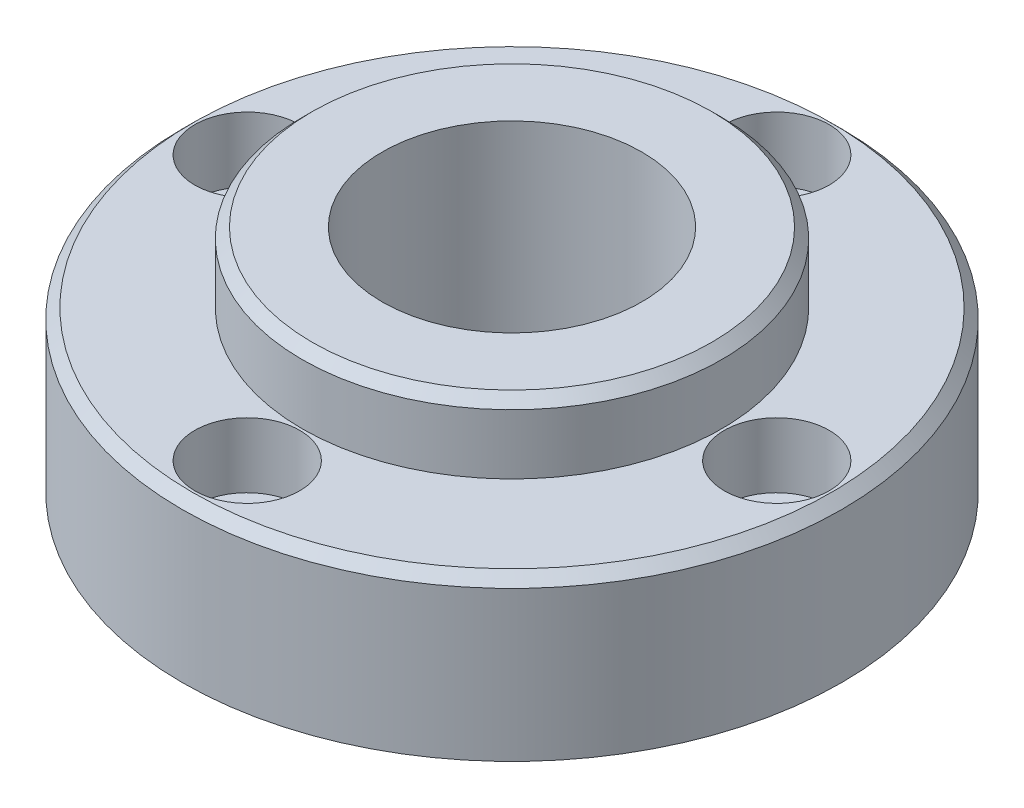
ISO-10303-21;
HEADER;
FILE_DESCRIPTION(('STEP AP214'),'2;1');
FILE_NAME('part.step','',(''),(''),'','','');
FILE_SCHEMA(('AUTOMOTIVE_DESIGN { 1 0 10303 214 1 1 1 1 }'));
ENDSEC;
DATA;
#1=APPLICATION_CONTEXT('core data for automotive mechanical design processes');
#2=APPLICATION_PROTOCOL_DEFINITION('international standard','automotive_design',2000,#1);
#3=PRODUCT_CONTEXT('',#1,'mechanical');
#4=PRODUCT('Part','Part','',(#3));
#5=PRODUCT_RELATED_PRODUCT_CATEGORY('part','',(#4));
#6=PRODUCT_DEFINITION_FORMATION('','',#4);
#7=PRODUCT_DEFINITION_CONTEXT('part definition',#1,'design');
#8=PRODUCT_DEFINITION('design','',#6,#7);
#9=PRODUCT_DEFINITION_SHAPE('','',#8);
#10=(LENGTH_UNIT() NAMED_UNIT(*) SI_UNIT(.MILLI.,.METRE.));
#11=(NAMED_UNIT(*) PLANE_ANGLE_UNIT() SI_UNIT($,.RADIAN.));
#12=(NAMED_UNIT(*) SI_UNIT($,.STERADIAN.) SOLID_ANGLE_UNIT());
#13=UNCERTAINTY_MEASURE_WITH_UNIT(LENGTH_MEASURE(1.E-05),#10,'distance_accuracy_value','');
#14=(GEOMETRIC_REPRESENTATION_CONTEXT(3) GLOBAL_UNCERTAINTY_ASSIGNED_CONTEXT((#13)) GLOBAL_UNIT_ASSIGNED_CONTEXT((#10,
#11,#12)) REPRESENTATION_CONTEXT('',''));
#15=CARTESIAN_POINT('',(0.,0.,0.));
#16=DIRECTION('',(0.,0.,1.));
#17=DIRECTION('',(1.,0.,0.));
#18=AXIS2_PLACEMENT_3D('',#15,#16,#17);
#19=CARTESIAN_POINT('',(0.,0.,0.));
#20=DIRECTION('',(0.,1.,0.));
#21=DIRECTION('',(0.,0.,1.));
#22=AXIS2_PLACEMENT_3D('',#19,#20,#21);
#23=PLANE('',#22);
#24=CARTESIAN_POINT('',(2.77572927208196E-13,0.,-26.5));
#25=DIRECTION('',(0.,1.,0.));
#26=DIRECTION('',(0.,0.,1.));
#27=AXIS2_PLACEMENT_3D('',#24,#25,#26);
#28=CIRCLE('',#27,3.25);
#29=CARTESIAN_POINT('',(2.77572927208196E-13,0.,-23.25));
#30=VERTEX_POINT('',#29);
#31=EDGE_CURVE('E115',#30,#30,#28,.T.);
#32=ORIENTED_EDGE('',*,*,#31,.T.);
#33=EDGE_LOOP('',(#32));
#34=FACE_BOUND('',#33,.T.);
#35=CARTESIAN_POINT('',(-26.5,0.,0.));
#36=DIRECTION('',(0.,1.,0.));
#37=DIRECTION('',(0.,0.,1.));
#38=AXIS2_PLACEMENT_3D('',#35,#36,#37);
#39=CIRCLE('',#38,3.25);
#40=CARTESIAN_POINT('',(-26.5,0.,3.25));
#41=VERTEX_POINT('',#40);
#42=EDGE_CURVE('E109',#41,#41,#39,.T.);
#43=ORIENTED_EDGE('',*,*,#42,.T.);
#44=EDGE_LOOP('',(#43));
#45=FACE_BOUND('',#44,.T.);
#46=CARTESIAN_POINT('',(0.,0.,26.5));
#47=DIRECTION('',(0.,1.,0.));
#48=DIRECTION('',(0.,0.,1.));
#49=AXIS2_PLACEMENT_3D('',#46,#47,#48);
#50=CIRCLE('',#49,3.25);
#51=CARTESIAN_POINT('',(0.,0.,29.75));
#52=VERTEX_POINT('',#51);
#53=EDGE_CURVE('E101',#52,#52,#50,.T.);
#54=ORIENTED_EDGE('',*,*,#53,.T.);
#55=EDGE_LOOP('',(#54));
#56=FACE_BOUND('',#55,.T.);
#57=CARTESIAN_POINT('',(26.5,0.,0.));
#58=DIRECTION('',(0.,1.,0.));
#59=DIRECTION('',(0.,0.,1.));
#60=AXIS2_PLACEMENT_3D('',#57,#58,#59);
#61=CIRCLE('',#60,3.25);
#62=CARTESIAN_POINT('',(26.5,0.,3.25));
#63=VERTEX_POINT('',#62);
#64=EDGE_CURVE('E77',#63,#63,#61,.T.);
#65=ORIENTED_EDGE('',*,*,#64,.T.);
#66=EDGE_LOOP('',(#65));
#67=FACE_BOUND('',#66,.T.);
#68=CARTESIAN_POINT('',(0.,0.,0.));
#69=DIRECTION('',(0.,1.,0.));
#70=DIRECTION('',(0.,0.,1.));
#71=AXIS2_PLACEMENT_3D('',#68,#69,#70);
#72=CIRCLE('',#71,33.);
#73=CARTESIAN_POINT('',(0.,0.,33.));
#74=VERTEX_POINT('',#73);
#75=EDGE_CURVE('E58',#74,#74,#72,.T.);
#76=ORIENTED_EDGE('',*,*,#75,.F.);
#77=EDGE_LOOP('',(#76));
#78=FACE_BOUND('',#77,.T.);
#79=CARTESIAN_POINT('',(0.,0.,0.));
#80=DIRECTION('',(0.,1.,0.));
#81=DIRECTION('',(0.,0.,1.));
#82=AXIS2_PLACEMENT_3D('',#79,#80,#81);
#83=CIRCLE('',#82,17.);
#84=CARTESIAN_POINT('',(0.,0.,17.));
#85=VERTEX_POINT('',#84);
#86=EDGE_CURVE('E55',#85,#85,#83,.F.);
#87=ORIENTED_EDGE('',*,*,#86,.F.);
#88=EDGE_LOOP('',(#87));
#89=FACE_BOUND('',#88,.T.);
#90=ADVANCED_FACE('F35',(#34,#45,#56,#67,#78,#89),#23,.F.);
#91=CARTESIAN_POINT('',(0.,16.,0.));
#92=DIRECTION('',(0.,1.,0.));
#93=DIRECTION('',(0.,0.,1.));
#94=AXIS2_PLACEMENT_3D('',#91,#92,#93);
#95=PLANE('',#94);
#96=CARTESIAN_POINT('',(2.77572927208196E-13,16.,-26.5));
#97=DIRECTION('',(0.,1.,0.));
#98=DIRECTION('',(1.,0.,0.));
#99=AXIS2_PLACEMENT_3D('',#96,#97,#98);
#100=CIRCLE('',#99,5.24999999999999);
#101=CARTESIAN_POINT('',(2.77572927208196E-13,16.,-21.25));
#102=VERTEX_POINT('',#101);
#103=EDGE_CURVE('E98',#102,#102,#100,.T.);
#104=ORIENTED_EDGE('',*,*,#103,.F.);
#105=EDGE_LOOP('',(#104));
#106=FACE_BOUND('',#105,.T.);
#107=CARTESIAN_POINT('',(-26.5,16.,0.));
#108=DIRECTION('',(0.,1.,0.));
#109=DIRECTION('',(0.,0.,-1.));
#110=AXIS2_PLACEMENT_3D('',#107,#108,#109);
#111=CIRCLE('',#110,5.24999999999999);
#112=CARTESIAN_POINT('',(-26.5,16.,5.24999999999999));
#113=VERTEX_POINT('',#112);
#114=EDGE_CURVE('E92',#113,#113,#111,.T.);
#115=ORIENTED_EDGE('',*,*,#114,.F.);
#116=EDGE_LOOP('',(#115));
#117=FACE_BOUND('',#116,.T.);
#118=CARTESIAN_POINT('',(0.,16.,26.5));
#119=DIRECTION('',(0.,1.,0.));
#120=DIRECTION('',(-1.,0.,0.));
#121=AXIS2_PLACEMENT_3D('',#118,#119,#120);
#122=CIRCLE('',#121,5.24999999999999);
#123=CARTESIAN_POINT('',(0.,16.,31.75));
#124=VERTEX_POINT('',#123);
#125=EDGE_CURVE('E86',#124,#124,#122,.T.);
#126=ORIENTED_EDGE('',*,*,#125,.F.);
#127=EDGE_LOOP('',(#126));
#128=FACE_BOUND('',#127,.T.);
#129=CARTESIAN_POINT('',(26.5,16.,0.));
#130=DIRECTION('',(0.,1.,0.));
#131=DIRECTION('',(0.,0.,1.));
#132=AXIS2_PLACEMENT_3D('',#129,#130,#131);
#133=CIRCLE('',#132,5.24999999999999);
#134=CARTESIAN_POINT('',(26.5,16.,5.24999999999999));
#135=VERTEX_POINT('',#134);
#136=EDGE_CURVE('E74',#135,#135,#133,.T.);
#137=ORIENTED_EDGE('',*,*,#136,.F.);
#138=EDGE_LOOP('',(#137));
#139=FACE_BOUND('',#138,.T.);
#140=CARTESIAN_POINT('',(0.,16.,0.));
#141=DIRECTION('',(0.,1.,0.));
#142=DIRECTION('',(0.,0.,1.));
#143=AXIS2_PLACEMENT_3D('',#140,#141,#142);
#144=CIRCLE('',#143,32.);
#145=CARTESIAN_POINT('',(0.,16.,32.));
#146=VERTEX_POINT('',#145);
#147=EDGE_CURVE('E50',#146,#146,#144,.T.);
#148=ORIENTED_EDGE('',*,*,#147,.T.);
#149=EDGE_LOOP('',(#148));
#150=FACE_BOUND('',#149,.T.);
#151=CARTESIAN_POINT('',(0.,16.,0.));
#152=DIRECTION('',(0.,1.,0.));
#153=DIRECTION('',(0.,0.,1.));
#154=AXIS2_PLACEMENT_3D('',#151,#152,#153);
#155=CIRCLE('',#154,21.);
#156=CARTESIAN_POINT('',(0.,16.,21.));
#157=VERTEX_POINT('',#156);
#158=EDGE_CURVE('E61',#157,#157,#155,.T.);
#159=ORIENTED_EDGE('',*,*,#158,.F.);
#160=EDGE_LOOP('',(#159));
#161=FACE_BOUND('',#160,.T.);
#162=ADVANCED_FACE('F139',(#106,#117,#128,#139,#150,#161),#95,.T.);
#163=CARTESIAN_POINT('',(0.,16.,0.));
#164=DIRECTION('',(0.,-1.,0.));
#165=DIRECTION('',(0.,0.,-1.));
#166=AXIS2_PLACEMENT_3D('',#163,#164,#165);
#167=CYLINDRICAL_SURFACE('',#166,33.);
#168=CARTESIAN_POINT('',(0.,15.,0.));
#169=DIRECTION('',(0.,1.,0.));
#170=DIRECTION('',(0.,0.,1.));
#171=AXIS2_PLACEMENT_3D('',#168,#169,#170);
#172=CIRCLE('',#171,33.);
#173=CARTESIAN_POINT('',(0.,15.,33.));
#174=VERTEX_POINT('',#173);
#175=EDGE_CURVE('E46',#174,#174,#172,.F.);
#176=ORIENTED_EDGE('',*,*,#175,.T.);
#177=EDGE_LOOP('',(#176));
#178=FACE_BOUND('',#177,.T.);
#179=ORIENTED_EDGE('',*,*,#75,.T.);
#180=EDGE_LOOP('',(#179));
#181=FACE_BOUND('',#180,.T.);
#182=ADVANCED_FACE('F142',(#178,#181),#167,.T.);
#183=CARTESIAN_POINT('',(0.,23.,0.));
#184=DIRECTION('',(0.,-1.,0.));
#185=DIRECTION('',(0.,0.,-1.));
#186=AXIS2_PLACEMENT_3D('',#183,#184,#185);
#187=CYLINDRICAL_SURFACE('',#186,21.);
#188=CARTESIAN_POINT('',(0.,22.,0.));
#189=DIRECTION('',(0.,1.,0.));
#190=DIRECTION('',(0.,0.,1.));
#191=AXIS2_PLACEMENT_3D('',#188,#189,#190);
#192=CIRCLE('',#191,21.);
#193=CARTESIAN_POINT('',(0.,22.,21.));
#194=VERTEX_POINT('',#193);
#195=EDGE_CURVE('E10',#194,#194,#192,.F.);
#196=ORIENTED_EDGE('',*,*,#195,.T.);
#197=EDGE_LOOP('',(#196));
#198=FACE_BOUND('',#197,.T.);
#199=ORIENTED_EDGE('',*,*,#158,.T.);
#200=EDGE_LOOP('',(#199));
#201=FACE_BOUND('',#200,.T.);
#202=ADVANCED_FACE('F154',(#198,#201),#187,.T.);
#203=CARTESIAN_POINT('',(0.,23.,0.));
#204=DIRECTION('',(0.,1.,0.));
#205=DIRECTION('',(0.,0.,1.));
#206=AXIS2_PLACEMENT_3D('',#203,#204,#205);
#207=PLANE('',#206);
#208=CARTESIAN_POINT('',(0.,23.,0.));
#209=DIRECTION('',(0.,1.,0.));
#210=DIRECTION('',(0.,0.,1.));
#211=AXIS2_PLACEMENT_3D('',#208,#209,#210);
#212=CIRCLE('',#211,20.);
#213=CARTESIAN_POINT('',(0.,23.,20.));
#214=VERTEX_POINT('',#213);
#215=EDGE_CURVE('E42',#214,#214,#212,.T.);
#216=ORIENTED_EDGE('',*,*,#215,.T.);
#217=EDGE_LOOP('',(#216));
#218=FACE_BOUND('',#217,.T.);
#219=CARTESIAN_POINT('',(0.,23.,0.));
#220=DIRECTION('',(0.,1.,0.));
#221=DIRECTION('',(0.,0.,1.));
#222=AXIS2_PLACEMENT_3D('',#219,#220,#221);
#223=CIRCLE('',#222,13.);
#224=CARTESIAN_POINT('',(0.,23.,13.));
#225=VERTEX_POINT('',#224);
#226=EDGE_CURVE('E68',#225,#225,#223,.T.);
#227=ORIENTED_EDGE('',*,*,#226,.F.);
#228=EDGE_LOOP('',(#227));
#229=FACE_BOUND('',#228,.T.);
#230=ADVANCED_FACE('F156',(#218,#229),#207,.T.);
#231=CARTESIAN_POINT('',(0.,-1.5,0.));
#232=DIRECTION('',(0.,1.,0.));
#233=DIRECTION('',(0.,0.,1.));
#234=AXIS2_PLACEMENT_3D('',#231,#232,#233);
#235=CYLINDRICAL_SURFACE('',#234,17.);
#236=CARTESIAN_POINT('',(0.,-1.5,0.));
#237=DIRECTION('',(0.,-1.,0.));
#238=DIRECTION('',(0.,0.,-1.));
#239=AXIS2_PLACEMENT_3D('',#236,#237,#238);
#240=CIRCLE('',#239,17.);
#241=CARTESIAN_POINT('',(0.,-1.5,-17.));
#242=VERTEX_POINT('',#241);
#243=EDGE_CURVE('E64',#242,#242,#240,.T.);
#244=ORIENTED_EDGE('',*,*,#243,.F.);
#245=EDGE_LOOP('',(#244));
#246=FACE_BOUND('',#245,.T.);
#247=ORIENTED_EDGE('',*,*,#86,.T.);
#248=EDGE_LOOP('',(#247));
#249=FACE_BOUND('',#248,.T.);
#250=ADVANCED_FACE('F162',(#246,#249),#235,.T.);
#251=CARTESIAN_POINT('',(0.,-1.5,0.));
#252=DIRECTION('',(0.,-1.,0.));
#253=DIRECTION('',(0.,0.,-1.));
#254=AXIS2_PLACEMENT_3D('',#251,#252,#253);
#255=PLANE('',#254);
#256=CARTESIAN_POINT('',(0.,-1.5,0.));
#257=DIRECTION('',(0.,1.,0.));
#258=DIRECTION('',(0.,0.,1.));
#259=AXIS2_PLACEMENT_3D('',#256,#257,#258);
#260=CIRCLE('',#259,13.);
#261=CARTESIAN_POINT('',(0.,-1.5,13.));
#262=VERTEX_POINT('',#261);
#263=EDGE_CURVE('E67',#262,#262,#260,.T.);
#264=ORIENTED_EDGE('',*,*,#263,.T.);
#265=EDGE_LOOP('',(#264));
#266=FACE_BOUND('',#265,.T.);
#267=ORIENTED_EDGE('',*,*,#243,.T.);
#268=EDGE_LOOP('',(#267));
#269=FACE_BOUND('',#268,.T.);
#270=ADVANCED_FACE('F184',(#266,#269),#255,.T.);
#271=CARTESIAN_POINT('',(0.,-1.5,0.));
#272=DIRECTION('',(0.,1.,0.));
#273=DIRECTION('',(0.,0.,1.));
#274=AXIS2_PLACEMENT_3D('',#271,#272,#273);
#275=CYLINDRICAL_SURFACE('',#274,13.);
#276=ORIENTED_EDGE('',*,*,#263,.F.);
#277=EDGE_LOOP('',(#276));
#278=FACE_BOUND('',#277,.T.);
#279=ORIENTED_EDGE('',*,*,#226,.T.);
#280=EDGE_LOOP('',(#279));
#281=FACE_BOUND('',#280,.T.);
#282=ADVANCED_FACE('F175',(#278,#281),#275,.F.);
#283=CARTESIAN_POINT('',(0.,16.,0.));
#284=DIRECTION('',(0.,-1.,0.));
#285=DIRECTION('',(0.,0.,-1.));
#286=AXIS2_PLACEMENT_3D('',#283,#284,#285);
#287=CONICAL_SURFACE('',#286,32.,0.785398163397438);
#288=ORIENTED_EDGE('',*,*,#175,.F.);
#289=EDGE_LOOP('',(#288));
#290=FACE_BOUND('',#289,.T.);
#291=ORIENTED_EDGE('',*,*,#147,.F.);
#292=EDGE_LOOP('',(#291));
#293=FACE_BOUND('',#292,.T.);
#294=ADVANCED_FACE('F172',(#290,#293),#287,.T.);
#295=CARTESIAN_POINT('',(26.5,9.5,0.));
#296=DIRECTION('',(0.,1.,0.));
#297=DIRECTION('',(0.,0.,1.));
#298=AXIS2_PLACEMENT_3D('',#295,#296,#297);
#299=CYLINDRICAL_SURFACE('',#298,5.24999999999999);
#300=CARTESIAN_POINT('',(26.5,9.5,0.));
#301=DIRECTION('',(0.,1.,0.));
#302=DIRECTION('',(0.,0.,1.));
#303=AXIS2_PLACEMENT_3D('',#300,#301,#302);
#304=CIRCLE('',#303,5.24999999999999);
#305=CARTESIAN_POINT('',(26.5,9.5,5.24999999999999));
#306=VERTEX_POINT('',#305);
#307=EDGE_CURVE('E71',#306,#306,#304,.T.);
#308=CARTESIAN_POINT('',(26.5,9.5,5.24999999999999));
#309=CARTESIAN_POINT('',(26.5,9.56770833333333,5.24999999999999));
#310=CARTESIAN_POINT('',(26.5,9.63541666666667,5.24999999999999));
#311=CARTESIAN_POINT('',(26.5,9.77083333333333,5.24999999999999));
#312=CARTESIAN_POINT('',(26.5,9.83854166666667,5.24999999999999));
#313=CARTESIAN_POINT('',(26.5,9.97395833333333,5.24999999999999));
#314=CARTESIAN_POINT('',(26.5,10.0416666666667,5.24999999999999));
#315=CARTESIAN_POINT('',(26.5,10.1770833333333,5.24999999999999));
#316=CARTESIAN_POINT('',(26.5,10.2447916666667,5.24999999999999));
#317=CARTESIAN_POINT('',(26.5,10.3802083333333,5.24999999999999));
#318=CARTESIAN_POINT('',(26.5,10.4479166666667,5.24999999999999));
#319=CARTESIAN_POINT('',(26.5,10.5833333333333,5.24999999999999));
#320=CARTESIAN_POINT('',(26.5,10.6510416666667,5.24999999999999));
#321=CARTESIAN_POINT('',(26.5,10.7864583333333,5.24999999999999));
#322=CARTESIAN_POINT('',(26.5,10.8541666666667,5.24999999999999));
#323=CARTESIAN_POINT('',(26.5,10.9895833333333,5.24999999999999));
#324=CARTESIAN_POINT('',(26.5,11.0572916666667,5.24999999999999));
#325=CARTESIAN_POINT('',(26.5,11.1927083333333,5.24999999999999));
#326=CARTESIAN_POINT('',(26.5,11.2604166666667,5.24999999999999));
#327=CARTESIAN_POINT('',(26.5,11.3958333333333,5.24999999999999));
#328=CARTESIAN_POINT('',(26.5,11.4635416666667,5.24999999999999));
#329=CARTESIAN_POINT('',(26.5,11.5989583333333,5.24999999999999));
#330=CARTESIAN_POINT('',(26.5,11.6666666666667,5.24999999999999));
#331=CARTESIAN_POINT('',(26.5,11.8020833333333,5.24999999999999));
#332=CARTESIAN_POINT('',(26.5,11.8697916666667,5.24999999999999));
#333=CARTESIAN_POINT('',(26.5,12.0052083333333,5.24999999999999));
#334=CARTESIAN_POINT('',(26.5,12.0729166666667,5.24999999999999));
#335=CARTESIAN_POINT('',(26.5,12.2083333333333,5.24999999999999));
#336=CARTESIAN_POINT('',(26.5,12.2760416666667,5.24999999999999));
#337=CARTESIAN_POINT('',(26.5,12.4114583333333,5.24999999999999));
#338=CARTESIAN_POINT('',(26.5,12.4791666666667,5.24999999999999));
#339=CARTESIAN_POINT('',(26.5,12.6145833333333,5.24999999999999));
#340=CARTESIAN_POINT('',(26.5,12.6822916666667,5.24999999999999));
#341=CARTESIAN_POINT('',(26.5,12.8177083333333,5.24999999999999));
#342=CARTESIAN_POINT('',(26.5,12.8854166666667,5.24999999999999));
#343=CARTESIAN_POINT('',(26.5,13.0208333333333,5.24999999999999));
#344=CARTESIAN_POINT('',(26.5,13.0885416666667,5.24999999999999));
#345=CARTESIAN_POINT('',(26.5,13.2239583333333,5.24999999999999));
#346=CARTESIAN_POINT('',(26.5,13.2916666666667,5.24999999999999));
#347=CARTESIAN_POINT('',(26.5,13.4270833333333,5.24999999999999));
#348=CARTESIAN_POINT('',(26.5,13.4947916666667,5.24999999999999));
#349=CARTESIAN_POINT('',(26.5,13.6302083333333,5.24999999999999));
#350=CARTESIAN_POINT('',(26.5,13.6979166666667,5.24999999999999));
#351=CARTESIAN_POINT('',(26.5,13.8333333333333,5.24999999999999));
#352=CARTESIAN_POINT('',(26.5,13.9010416666667,5.24999999999999));
#353=CARTESIAN_POINT('',(26.5,14.0364583333333,5.24999999999999));
#354=CARTESIAN_POINT('',(26.5,14.1041666666667,5.24999999999999));
#355=CARTESIAN_POINT('',(26.5,14.2395833333333,5.24999999999999));
#356=CARTESIAN_POINT('',(26.5,14.3072916666667,5.24999999999999));
#357=CARTESIAN_POINT('',(26.5,14.4427083333333,5.24999999999999));
#358=CARTESIAN_POINT('',(26.5,14.5104166666667,5.24999999999999));
#359=CARTESIAN_POINT('',(26.5,14.6458333333333,5.24999999999999));
#360=CARTESIAN_POINT('',(26.5,14.7135416666667,5.24999999999999));
#361=CARTESIAN_POINT('',(26.5,14.8489583333333,5.24999999999999));
#362=CARTESIAN_POINT('',(26.5,14.9166666666667,5.24999999999999));
#363=CARTESIAN_POINT('',(26.5,15.0520833333333,5.24999999999999));
#364=CARTESIAN_POINT('',(26.5,15.1197916666667,5.24999999999999));
#365=CARTESIAN_POINT('',(26.5,15.2552083333333,5.24999999999999));
#366=CARTESIAN_POINT('',(26.5,15.3229166666667,5.24999999999999));
#367=CARTESIAN_POINT('',(26.5,15.4583333333333,5.24999999999999));
#368=CARTESIAN_POINT('',(26.5,15.5260416666667,5.24999999999999));
#369=CARTESIAN_POINT('',(26.5,15.6614583333333,5.24999999999999));
#370=CARTESIAN_POINT('',(26.5,15.7291666666667,5.24999999999999));
#371=CARTESIAN_POINT('',(26.5,15.8645833333333,5.24999999999999));
#372=CARTESIAN_POINT('',(26.5,15.9322916666667,5.24999999999999));
#373=CARTESIAN_POINT('',(26.5,16.,5.24999999999999));
#374=B_SPLINE_CURVE_WITH_KNOTS('',3,(#308,#309,#310,#311,#312,#313,#314,#315,#316,#317,#318,
#319,#320,#321,#322,#323,#324,#325,#326,#327,#328,#329,#330,#331,#332,#333,#334,#335,#336,#337,
#338,#339,#340,#341,#342,#343,#344,#345,#346,#347,#348,#349,#350,#351,#352,#353,#354,#355,#356,
#357,#358,#359,#360,#361,#362,#363,#364,#365,#366,#367,#368,#369,#370,#371,#372,#373),
.UNSPECIFIED.,.F.,.F.,(4,2,2,2,2,2,2,2,2,2,2,2,2,2,2,2,2,2,2,2,2,2,2,2,2,2,2,2,2,2,2,2,4),(0.,
0.203124999999998,0.406249999999999,0.609374999999999,0.812499999999999,1.015625,1.21875,
1.421875,1.625,1.828125,2.03125,2.234375,2.4375,2.640625,2.84375,3.046875,3.25,3.453125,3.65625,
3.859375,4.0625,4.265625,4.46875,4.671875,4.875,5.078125,5.28125,5.484375,5.6875,5.890625,
6.09375,6.296875,6.5),.UNSPECIFIED.);
#375=EDGE_CURVE('BSEAM174',#306,#135,#374,.T.);
#376=ORIENTED_EDGE('',*,*,#307,.F.);
#377=ORIENTED_EDGE('',*,*,#136,.T.);
#378=ORIENTED_EDGE('',*,*,#375,.T.);
#379=ORIENTED_EDGE('',*,*,#375,.F.);
#380=EDGE_LOOP('',(#376,#378,#377,#379));
#381=FACE_BOUND('',#380,.T.);
#382=ADVANCED_FACE('F174',(#381),#299,.F.);
#383=CARTESIAN_POINT('',(26.5,9.5,0.));
#384=DIRECTION('',(0.,1.,0.));
#385=DIRECTION('',(0.,0.,1.));
#386=AXIS2_PLACEMENT_3D('',#383,#384,#385);
#387=PLANE('',#386);
#388=CARTESIAN_POINT('',(26.5,9.5,0.));
#389=DIRECTION('',(0.,1.,0.));
#390=DIRECTION('',(0.,0.,1.));
#391=AXIS2_PLACEMENT_3D('',#388,#389,#390);
#392=CIRCLE('',#391,3.25);
#393=CARTESIAN_POINT('',(26.5,9.5,3.25));
#394=VERTEX_POINT('',#393);
#395=EDGE_CURVE('E82',#394,#394,#392,.T.);
#396=ORIENTED_EDGE('',*,*,#395,.F.);
#397=EDGE_LOOP('',(#396));
#398=FACE_BOUND('',#397,.T.);
#399=ORIENTED_EDGE('',*,*,#307,.T.);
#400=EDGE_LOOP('',(#399));
#401=FACE_BOUND('',#400,.T.);
#402=ADVANCED_FACE('F181',(#398,#401),#387,.T.);
#403=CARTESIAN_POINT('',(26.5,-1.5,0.));
#404=DIRECTION('',(0.,1.,0.));
#405=DIRECTION('',(0.,0.,1.));
#406=AXIS2_PLACEMENT_3D('',#403,#404,#405);
#407=CYLINDRICAL_SURFACE('',#406,3.25);
#408=ORIENTED_EDGE('',*,*,#395,.T.);
#409=EDGE_LOOP('',(#408));
#410=FACE_BOUND('',#409,.T.);
#411=ORIENTED_EDGE('',*,*,#64,.F.);
#412=EDGE_LOOP('',(#411));
#413=FACE_BOUND('',#412,.T.);
#414=ADVANCED_FACE('F207',(#410,#413),#407,.F.);
#415=CARTESIAN_POINT('',(0.,9.5,26.5));
#416=DIRECTION('',(0.,1.,0.));
#417=DIRECTION('',(0.,0.,1.));
#418=AXIS2_PLACEMENT_3D('',#415,#416,#417);
#419=CYLINDRICAL_SURFACE('',#418,5.24999999999999);
#420=CARTESIAN_POINT('',(0.,9.5,26.5));
#421=DIRECTION('',(0.,1.,0.));
#422=DIRECTION('',(-1.,0.,0.));
#423=AXIS2_PLACEMENT_3D('',#420,#421,#422);
#424=CIRCLE('',#423,5.24999999999999);
#425=CARTESIAN_POINT('',(0.,9.5,31.75));
#426=VERTEX_POINT('',#425);
#427=EDGE_CURVE('E85',#426,#426,#424,.T.);
#428=CARTESIAN_POINT('',(0.,9.5,31.75));
#429=CARTESIAN_POINT('',(0.,9.56770833333333,31.75));
#430=CARTESIAN_POINT('',(0.,9.63541666666667,31.75));
#431=CARTESIAN_POINT('',(0.,9.77083333333333,31.75));
#432=CARTESIAN_POINT('',(0.,9.83854166666667,31.75));
#433=CARTESIAN_POINT('',(0.,9.97395833333333,31.75));
#434=CARTESIAN_POINT('',(0.,10.0416666666667,31.75));
#435=CARTESIAN_POINT('',(0.,10.1770833333333,31.75));
#436=CARTESIAN_POINT('',(0.,10.2447916666667,31.75));
#437=CARTESIAN_POINT('',(0.,10.3802083333333,31.75));
#438=CARTESIAN_POINT('',(0.,10.4479166666667,31.75));
#439=CARTESIAN_POINT('',(0.,10.5833333333333,31.75));
#440=CARTESIAN_POINT('',(0.,10.6510416666667,31.75));
#441=CARTESIAN_POINT('',(0.,10.7864583333333,31.75));
#442=CARTESIAN_POINT('',(0.,10.8541666666667,31.75));
#443=CARTESIAN_POINT('',(0.,10.9895833333333,31.75));
#444=CARTESIAN_POINT('',(0.,11.0572916666667,31.75));
#445=CARTESIAN_POINT('',(0.,11.1927083333333,31.75));
#446=CARTESIAN_POINT('',(0.,11.2604166666667,31.75));
#447=CARTESIAN_POINT('',(0.,11.3958333333333,31.75));
#448=CARTESIAN_POINT('',(0.,11.4635416666667,31.75));
#449=CARTESIAN_POINT('',(0.,11.5989583333333,31.75));
#450=CARTESIAN_POINT('',(0.,11.6666666666667,31.75));
#451=CARTESIAN_POINT('',(0.,11.8020833333333,31.75));
#452=CARTESIAN_POINT('',(0.,11.8697916666667,31.75));
#453=CARTESIAN_POINT('',(0.,12.0052083333333,31.75));
#454=CARTESIAN_POINT('',(0.,12.0729166666667,31.75));
#455=CARTESIAN_POINT('',(0.,12.2083333333333,31.75));
#456=CARTESIAN_POINT('',(0.,12.2760416666667,31.75));
#457=CARTESIAN_POINT('',(0.,12.4114583333333,31.75));
#458=CARTESIAN_POINT('',(0.,12.4791666666667,31.75));
#459=CARTESIAN_POINT('',(0.,12.6145833333333,31.75));
#460=CARTESIAN_POINT('',(0.,12.6822916666667,31.75));
#461=CARTESIAN_POINT('',(0.,12.8177083333333,31.75));
#462=CARTESIAN_POINT('',(0.,12.8854166666667,31.75));
#463=CARTESIAN_POINT('',(0.,13.0208333333333,31.75));
#464=CARTESIAN_POINT('',(0.,13.0885416666667,31.75));
#465=CARTESIAN_POINT('',(0.,13.2239583333333,31.75));
#466=CARTESIAN_POINT('',(0.,13.2916666666667,31.75));
#467=CARTESIAN_POINT('',(0.,13.4270833333333,31.75));
#468=CARTESIAN_POINT('',(0.,13.4947916666667,31.75));
#469=CARTESIAN_POINT('',(0.,13.6302083333333,31.75));
#470=CARTESIAN_POINT('',(0.,13.6979166666667,31.75));
#471=CARTESIAN_POINT('',(0.,13.8333333333333,31.75));
#472=CARTESIAN_POINT('',(0.,13.9010416666667,31.75));
#473=CARTESIAN_POINT('',(0.,14.0364583333333,31.75));
#474=CARTESIAN_POINT('',(0.,14.1041666666667,31.75));
#475=CARTESIAN_POINT('',(0.,14.2395833333333,31.75));
#476=CARTESIAN_POINT('',(0.,14.3072916666667,31.75));
#477=CARTESIAN_POINT('',(0.,14.4427083333333,31.75));
#478=CARTESIAN_POINT('',(0.,14.5104166666667,31.75));
#479=CARTESIAN_POINT('',(0.,14.6458333333333,31.75));
#480=CARTESIAN_POINT('',(0.,14.7135416666667,31.75));
#481=CARTESIAN_POINT('',(0.,14.8489583333333,31.75));
#482=CARTESIAN_POINT('',(0.,14.9166666666667,31.75));
#483=CARTESIAN_POINT('',(0.,15.0520833333333,31.75));
#484=CARTESIAN_POINT('',(0.,15.1197916666667,31.75));
#485=CARTESIAN_POINT('',(0.,15.2552083333333,31.75));
#486=CARTESIAN_POINT('',(0.,15.3229166666667,31.75));
#487=CARTESIAN_POINT('',(0.,15.4583333333333,31.75));
#488=CARTESIAN_POINT('',(0.,15.5260416666667,31.75));
#489=CARTESIAN_POINT('',(0.,15.6614583333333,31.75));
#490=CARTESIAN_POINT('',(0.,15.7291666666667,31.75));
#491=CARTESIAN_POINT('',(0.,15.8645833333333,31.75));
#492=CARTESIAN_POINT('',(0.,15.9322916666667,31.75));
#493=CARTESIAN_POINT('',(0.,16.,31.75));
#494=B_SPLINE_CURVE_WITH_KNOTS('',3,(#428,#429,#430,#431,#432,#433,#434,#435,#436,#437,#438,
#439,#440,#441,#442,#443,#444,#445,#446,#447,#448,#449,#450,#451,#452,#453,#454,#455,#456,#457,
#458,#459,#460,#461,#462,#463,#464,#465,#466,#467,#468,#469,#470,#471,#472,#473,#474,#475,#476,
#477,#478,#479,#480,#481,#482,#483,#484,#485,#486,#487,#488,#489,#490,#491,#492,#493),
.UNSPECIFIED.,.F.,.F.,(4,2,2,2,2,2,2,2,2,2,2,2,2,2,2,2,2,2,2,2,2,2,2,2,2,2,2,2,2,2,2,2,4),(0.,
0.203124999999998,0.406249999999999,0.609374999999999,0.812499999999999,1.015625,1.21875,
1.421875,1.625,1.828125,2.03125,2.234375,2.4375,2.640625,2.84375,3.046875,3.25,3.453125,3.65625,
3.859375,4.0625,4.265625,4.46875,4.671875,4.875,5.078125,5.28125,5.484375,5.6875,5.890625,
6.09375,6.296875,6.5),.UNSPECIFIED.);
#495=EDGE_CURVE('BSEAM211',#426,#124,#494,.T.);
#496=ORIENTED_EDGE('',*,*,#427,.F.);
#497=ORIENTED_EDGE('',*,*,#125,.T.);
#498=ORIENTED_EDGE('',*,*,#495,.T.);
#499=ORIENTED_EDGE('',*,*,#495,.F.);
#500=EDGE_LOOP('',(#496,#498,#497,#499));
#501=FACE_BOUND('',#500,.T.);
#502=ADVANCED_FACE('F211',(#501),#419,.F.);
#503=CARTESIAN_POINT('',(0.,9.5,26.5));
#504=DIRECTION('',(0.,1.,0.));
#505=DIRECTION('',(-1.,0.,0.));
#506=AXIS2_PLACEMENT_3D('',#503,#504,#505);
#507=PLANE('',#506);
#508=CARTESIAN_POINT('',(0.,9.5,26.5));
#509=DIRECTION('',(0.,1.,0.));
#510=DIRECTION('',(-1.,0.,0.));
#511=AXIS2_PLACEMENT_3D('',#508,#509,#510);
#512=CIRCLE('',#511,3.25);
#513=CARTESIAN_POINT('',(-3.25000000000009,9.5,26.5));
#514=VERTEX_POINT('',#513);
#515=EDGE_CURVE('E106',#514,#514,#512,.T.);
#516=ORIENTED_EDGE('',*,*,#515,.F.);
#517=EDGE_LOOP('',(#516));
#518=FACE_BOUND('',#517,.T.);
#519=ORIENTED_EDGE('',*,*,#427,.T.);
#520=EDGE_LOOP('',(#519));
#521=FACE_BOUND('',#520,.T.);
#522=ADVANCED_FACE('F215',(#518,#521),#507,.T.);
#523=CARTESIAN_POINT('',(-26.5,9.5,0.));
#524=DIRECTION('',(0.,1.,0.));
#525=DIRECTION('',(0.,0.,1.));
#526=AXIS2_PLACEMENT_3D('',#523,#524,#525);
#527=CYLINDRICAL_SURFACE('',#526,5.24999999999999);
#528=CARTESIAN_POINT('',(-26.5,9.5,0.));
#529=DIRECTION('',(0.,1.,0.));
#530=DIRECTION('',(0.,0.,-1.));
#531=AXIS2_PLACEMENT_3D('',#528,#529,#530);
#532=CIRCLE('',#531,5.24999999999999);
#533=CARTESIAN_POINT('',(-26.5,9.5,5.24999999999999));
#534=VERTEX_POINT('',#533);
#535=EDGE_CURVE('E89',#534,#534,#532,.T.);
#536=CARTESIAN_POINT('',(-26.5,9.5,5.24999999999999));
#537=CARTESIAN_POINT('',(-26.5,9.56770833333333,5.24999999999999));
#538=CARTESIAN_POINT('',(-26.5,9.63541666666667,5.24999999999999));
#539=CARTESIAN_POINT('',(-26.5,9.77083333333333,5.24999999999999));
#540=CARTESIAN_POINT('',(-26.5,9.83854166666667,5.24999999999999));
#541=CARTESIAN_POINT('',(-26.5,9.97395833333333,5.24999999999999));
#542=CARTESIAN_POINT('',(-26.5,10.0416666666667,5.24999999999999));
#543=CARTESIAN_POINT('',(-26.5,10.1770833333333,5.24999999999999));
#544=CARTESIAN_POINT('',(-26.5,10.2447916666667,5.24999999999999));
#545=CARTESIAN_POINT('',(-26.5,10.3802083333333,5.24999999999999));
#546=CARTESIAN_POINT('',(-26.5,10.4479166666667,5.24999999999999));
#547=CARTESIAN_POINT('',(-26.5,10.5833333333333,5.24999999999999));
#548=CARTESIAN_POINT('',(-26.5,10.6510416666667,5.24999999999999));
#549=CARTESIAN_POINT('',(-26.5,10.7864583333333,5.24999999999999));
#550=CARTESIAN_POINT('',(-26.5,10.8541666666667,5.24999999999999));
#551=CARTESIAN_POINT('',(-26.5,10.9895833333333,5.24999999999999));
#552=CARTESIAN_POINT('',(-26.5,11.0572916666667,5.24999999999999));
#553=CARTESIAN_POINT('',(-26.5,11.1927083333333,5.24999999999999));
#554=CARTESIAN_POINT('',(-26.5,11.2604166666667,5.24999999999999));
#555=CARTESIAN_POINT('',(-26.5,11.3958333333333,5.24999999999999));
#556=CARTESIAN_POINT('',(-26.5,11.4635416666667,5.24999999999999));
#557=CARTESIAN_POINT('',(-26.5,11.5989583333333,5.24999999999999));
#558=CARTESIAN_POINT('',(-26.5,11.6666666666667,5.24999999999999));
#559=CARTESIAN_POINT('',(-26.5,11.8020833333333,5.24999999999999));
#560=CARTESIAN_POINT('',(-26.5,11.8697916666667,5.24999999999999));
#561=CARTESIAN_POINT('',(-26.5,12.0052083333333,5.24999999999999));
#562=CARTESIAN_POINT('',(-26.5,12.0729166666667,5.24999999999999));
#563=CARTESIAN_POINT('',(-26.5,12.2083333333333,5.24999999999999));
#564=CARTESIAN_POINT('',(-26.5,12.2760416666667,5.24999999999999));
#565=CARTESIAN_POINT('',(-26.5,12.4114583333333,5.24999999999999));
#566=CARTESIAN_POINT('',(-26.5,12.4791666666667,5.24999999999999));
#567=CARTESIAN_POINT('',(-26.5,12.6145833333333,5.24999999999999));
#568=CARTESIAN_POINT('',(-26.5,12.6822916666667,5.24999999999999));
#569=CARTESIAN_POINT('',(-26.5,12.8177083333333,5.24999999999999));
#570=CARTESIAN_POINT('',(-26.5,12.8854166666667,5.24999999999999));
#571=CARTESIAN_POINT('',(-26.5,13.0208333333333,5.24999999999999));
#572=CARTESIAN_POINT('',(-26.5,13.0885416666667,5.24999999999999));
#573=CARTESIAN_POINT('',(-26.5,13.2239583333333,5.24999999999999));
#574=CARTESIAN_POINT('',(-26.5,13.2916666666667,5.24999999999999));
#575=CARTESIAN_POINT('',(-26.5,13.4270833333333,5.24999999999999));
#576=CARTESIAN_POINT('',(-26.5,13.4947916666667,5.24999999999999));
#577=CARTESIAN_POINT('',(-26.5,13.6302083333333,5.24999999999999));
#578=CARTESIAN_POINT('',(-26.5,13.6979166666667,5.24999999999999));
#579=CARTESIAN_POINT('',(-26.5,13.8333333333333,5.24999999999999));
#580=CARTESIAN_POINT('',(-26.5,13.9010416666667,5.24999999999999));
#581=CARTESIAN_POINT('',(-26.5,14.0364583333333,5.24999999999999));
#582=CARTESIAN_POINT('',(-26.5,14.1041666666667,5.24999999999999));
#583=CARTESIAN_POINT('',(-26.5,14.2395833333333,5.24999999999999));
#584=CARTESIAN_POINT('',(-26.5,14.3072916666667,5.24999999999999));
#585=CARTESIAN_POINT('',(-26.5,14.4427083333333,5.24999999999999));
#586=CARTESIAN_POINT('',(-26.5,14.5104166666667,5.24999999999999));
#587=CARTESIAN_POINT('',(-26.5,14.6458333333333,5.24999999999999));
#588=CARTESIAN_POINT('',(-26.5,14.7135416666667,5.24999999999999));
#589=CARTESIAN_POINT('',(-26.5,14.8489583333333,5.24999999999999));
#590=CARTESIAN_POINT('',(-26.5,14.9166666666667,5.24999999999999));
#591=CARTESIAN_POINT('',(-26.5,15.0520833333333,5.24999999999999));
#592=CARTESIAN_POINT('',(-26.5,15.1197916666667,5.24999999999999));
#593=CARTESIAN_POINT('',(-26.5,15.2552083333333,5.24999999999999));
#594=CARTESIAN_POINT('',(-26.5,15.3229166666667,5.24999999999999));
#595=CARTESIAN_POINT('',(-26.5,15.4583333333333,5.24999999999999));
#596=CARTESIAN_POINT('',(-26.5,15.5260416666667,5.24999999999999));
#597=CARTESIAN_POINT('',(-26.5,15.6614583333333,5.24999999999999));
#598=CARTESIAN_POINT('',(-26.5,15.7291666666667,5.24999999999999));
#599=CARTESIAN_POINT('',(-26.5,15.8645833333333,5.24999999999999));
#600=CARTESIAN_POINT('',(-26.5,15.9322916666667,5.24999999999999));
#601=CARTESIAN_POINT('',(-26.5,16.,5.24999999999999));
#602=B_SPLINE_CURVE_WITH_KNOTS('',3,(#536,#537,#538,#539,#540,#541,#542,#543,#544,#545,#546,
#547,#548,#549,#550,#551,#552,#553,#554,#555,#556,#557,#558,#559,#560,#561,#562,#563,#564,#565,
#566,#567,#568,#569,#570,#571,#572,#573,#574,#575,#576,#577,#578,#579,#580,#581,#582,#583,#584,
#585,#586,#587,#588,#589,#590,#591,#592,#593,#594,#595,#596,#597,#598,#599,#600,#601),
.UNSPECIFIED.,.F.,.F.,(4,2,2,2,2,2,2,2,2,2,2,2,2,2,2,2,2,2,2,2,2,2,2,2,2,2,2,2,2,2,2,2,4),(0.,
0.203124999999998,0.406249999999999,0.609374999999999,0.812499999999999,1.015625,1.21875,
1.421875,1.625,1.828125,2.03125,2.234375,2.4375,2.640625,2.84375,3.046875,3.25,3.453125,3.65625,
3.859375,4.0625,4.265625,4.46875,4.671875,4.875,5.078125,5.28125,5.484375,5.6875,5.890625,
6.09375,6.296875,6.5),.UNSPECIFIED.);
#603=EDGE_CURVE('BSEAM219',#534,#113,#602,.T.);
#604=ORIENTED_EDGE('',*,*,#535,.F.);
#605=ORIENTED_EDGE('',*,*,#114,.T.);
#606=ORIENTED_EDGE('',*,*,#603,.T.);
#607=ORIENTED_EDGE('',*,*,#603,.F.);
#608=EDGE_LOOP('',(#604,#606,#605,#607));
#609=FACE_BOUND('',#608,.T.);
#610=ADVANCED_FACE('F219',(#609),#527,.F.);
#611=CARTESIAN_POINT('',(-26.5,9.5,0.));
#612=DIRECTION('',(0.,1.,0.));
#613=DIRECTION('',(0.,0.,-1.));
#614=AXIS2_PLACEMENT_3D('',#611,#612,#613);
#615=PLANE('',#614);
#616=CARTESIAN_POINT('',(-26.5,9.5,0.));
#617=DIRECTION('',(0.,1.,0.));
#618=DIRECTION('',(0.,0.,-1.));
#619=AXIS2_PLACEMENT_3D('',#616,#617,#618);
#620=CIRCLE('',#619,3.25);
#621=CARTESIAN_POINT('',(-26.5,9.5,-3.25));
#622=VERTEX_POINT('',#621);
#623=EDGE_CURVE('E112',#622,#622,#620,.T.);
#624=ORIENTED_EDGE('',*,*,#623,.F.);
#625=EDGE_LOOP('',(#624));
#626=FACE_BOUND('',#625,.T.);
#627=ORIENTED_EDGE('',*,*,#535,.T.);
#628=EDGE_LOOP('',(#627));
#629=FACE_BOUND('',#628,.T.);
#630=ADVANCED_FACE('F135',(#626,#629),#615,.T.);
#631=CARTESIAN_POINT('',(2.77572927208196E-13,9.5,-26.5));
#632=DIRECTION('',(0.,1.,0.));
#633=DIRECTION('',(0.,0.,1.));
#634=AXIS2_PLACEMENT_3D('',#631,#632,#633);
#635=CYLINDRICAL_SURFACE('',#634,5.24999999999999);
#636=CARTESIAN_POINT('',(2.77572927208196E-13,9.5,-26.5));
#637=DIRECTION('',(0.,1.,0.));
#638=DIRECTION('',(1.,0.,0.));
#639=AXIS2_PLACEMENT_3D('',#636,#637,#638);
#640=CIRCLE('',#639,5.24999999999999);
#641=CARTESIAN_POINT('',(2.77572927208196E-13,9.5,-21.25));
#642=VERTEX_POINT('',#641);
#643=EDGE_CURVE('E95',#642,#642,#640,.T.);
#644=CARTESIAN_POINT('',(2.77572927208196E-13,9.5,-21.25));
#645=CARTESIAN_POINT('',(2.77572927208196E-13,9.56770833333333,-21.25));
#646=CARTESIAN_POINT('',(2.77572927208196E-13,9.63541666666667,-21.25));
#647=CARTESIAN_POINT('',(2.77572927208196E-13,9.77083333333333,-21.25));
#648=CARTESIAN_POINT('',(2.77572927208196E-13,9.83854166666667,-21.25));
#649=CARTESIAN_POINT('',(2.77572927208196E-13,9.97395833333333,-21.25));
#650=CARTESIAN_POINT('',(2.77572927208196E-13,10.0416666666667,-21.25));
#651=CARTESIAN_POINT('',(2.77572927208196E-13,10.1770833333333,-21.25));
#652=CARTESIAN_POINT('',(2.77572927208196E-13,10.2447916666667,-21.25));
#653=CARTESIAN_POINT('',(2.77572927208196E-13,10.3802083333333,-21.25));
#654=CARTESIAN_POINT('',(2.77572927208196E-13,10.4479166666667,-21.25));
#655=CARTESIAN_POINT('',(2.77572927208196E-13,10.5833333333333,-21.25));
#656=CARTESIAN_POINT('',(2.77572927208196E-13,10.6510416666667,-21.25));
#657=CARTESIAN_POINT('',(2.77572927208196E-13,10.7864583333333,-21.25));
#658=CARTESIAN_POINT('',(2.77572927208196E-13,10.8541666666667,-21.25));
#659=CARTESIAN_POINT('',(2.77572927208196E-13,10.9895833333333,-21.25));
#660=CARTESIAN_POINT('',(2.77572927208196E-13,11.0572916666667,-21.25));
#661=CARTESIAN_POINT('',(2.77572927208196E-13,11.1927083333333,-21.25));
#662=CARTESIAN_POINT('',(2.77572927208196E-13,11.2604166666667,-21.25));
#663=CARTESIAN_POINT('',(2.77572927208196E-13,11.3958333333333,-21.25));
#664=CARTESIAN_POINT('',(2.77572927208196E-13,11.4635416666667,-21.25));
#665=CARTESIAN_POINT('',(2.77572927208196E-13,11.5989583333333,-21.25));
#666=CARTESIAN_POINT('',(2.77572927208196E-13,11.6666666666667,-21.25));
#667=CARTESIAN_POINT('',(2.77572927208196E-13,11.8020833333333,-21.25));
#668=CARTESIAN_POINT('',(2.77572927208196E-13,11.8697916666667,-21.25));
#669=CARTESIAN_POINT('',(2.77572927208196E-13,12.0052083333333,-21.25));
#670=CARTESIAN_POINT('',(2.77572927208196E-13,12.0729166666667,-21.25));
#671=CARTESIAN_POINT('',(2.77572927208196E-13,12.2083333333333,-21.25));
#672=CARTESIAN_POINT('',(2.77572927208196E-13,12.2760416666667,-21.25));
#673=CARTESIAN_POINT('',(2.77572927208196E-13,12.4114583333333,-21.25));
#674=CARTESIAN_POINT('',(2.77572927208196E-13,12.4791666666667,-21.25));
#675=CARTESIAN_POINT('',(2.77572927208196E-13,12.6145833333333,-21.25));
#676=CARTESIAN_POINT('',(2.77572927208196E-13,12.6822916666667,-21.25));
#677=CARTESIAN_POINT('',(2.77572927208196E-13,12.8177083333333,-21.25));
#678=CARTESIAN_POINT('',(2.77572927208196E-13,12.8854166666667,-21.25));
#679=CARTESIAN_POINT('',(2.77572927208196E-13,13.0208333333333,-21.25));
#680=CARTESIAN_POINT('',(2.77572927208196E-13,13.0885416666667,-21.25));
#681=CARTESIAN_POINT('',(2.77572927208196E-13,13.2239583333333,-21.25));
#682=CARTESIAN_POINT('',(2.77572927208196E-13,13.2916666666667,-21.25));
#683=CARTESIAN_POINT('',(2.77572927208196E-13,13.4270833333333,-21.25));
#684=CARTESIAN_POINT('',(2.77572927208196E-13,13.4947916666667,-21.25));
#685=CARTESIAN_POINT('',(2.77572927208196E-13,13.6302083333333,-21.25));
#686=CARTESIAN_POINT('',(2.77572927208196E-13,13.6979166666667,-21.25));
#687=CARTESIAN_POINT('',(2.77572927208196E-13,13.8333333333333,-21.25));
#688=CARTESIAN_POINT('',(2.77572927208196E-13,13.9010416666667,-21.25));
#689=CARTESIAN_POINT('',(2.77572927208196E-13,14.0364583333333,-21.25));
#690=CARTESIAN_POINT('',(2.77572927208196E-13,14.1041666666667,-21.25));
#691=CARTESIAN_POINT('',(2.77572927208196E-13,14.2395833333333,-21.25));
#692=CARTESIAN_POINT('',(2.77572927208196E-13,14.3072916666667,-21.25));
#693=CARTESIAN_POINT('',(2.77572927208196E-13,14.4427083333333,-21.25));
#694=CARTESIAN_POINT('',(2.77572927208196E-13,14.5104166666667,-21.25));
#695=CARTESIAN_POINT('',(2.77572927208196E-13,14.6458333333333,-21.25));
#696=CARTESIAN_POINT('',(2.77572927208196E-13,14.7135416666667,-21.25));
#697=CARTESIAN_POINT('',(2.77572927208196E-13,14.8489583333333,-21.25));
#698=CARTESIAN_POINT('',(2.77572927208196E-13,14.9166666666667,-21.25));
#699=CARTESIAN_POINT('',(2.77572927208196E-13,15.0520833333333,-21.25));
#700=CARTESIAN_POINT('',(2.77572927208196E-13,15.1197916666667,-21.25));
#701=CARTESIAN_POINT('',(2.77572927208196E-13,15.2552083333333,-21.25));
#702=CARTESIAN_POINT('',(2.77572927208196E-13,15.3229166666667,-21.25));
#703=CARTESIAN_POINT('',(2.77572927208196E-13,15.4583333333333,-21.25));
#704=CARTESIAN_POINT('',(2.77572927208196E-13,15.5260416666667,-21.25));
#705=CARTESIAN_POINT('',(2.77572927208196E-13,15.6614583333333,-21.25));
#706=CARTESIAN_POINT('',(2.77572927208196E-13,15.7291666666667,-21.25));
#707=CARTESIAN_POINT('',(2.77572927208196E-13,15.8645833333333,-21.25));
#708=CARTESIAN_POINT('',(2.77572927208196E-13,15.9322916666667,-21.25));
#709=CARTESIAN_POINT('',(2.77572927208196E-13,16.,-21.25));
#710=B_SPLINE_CURVE_WITH_KNOTS('',3,(#644,#645,#646,#647,#648,#649,#650,#651,#652,#653,#654,
#655,#656,#657,#658,#659,#660,#661,#662,#663,#664,#665,#666,#667,#668,#669,#670,#671,#672,#673,
#674,#675,#676,#677,#678,#679,#680,#681,#682,#683,#684,#685,#686,#687,#688,#689,#690,#691,#692,
#693,#694,#695,#696,#697,#698,#699,#700,#701,#702,#703,#704,#705,#706,#707,#708,#709),
.UNSPECIFIED.,.F.,.F.,(4,2,2,2,2,2,2,2,2,2,2,2,2,2,2,2,2,2,2,2,2,2,2,2,2,2,2,2,2,2,2,2,4),(0.,
0.203124999999998,0.406249999999999,0.609374999999999,0.812499999999999,1.015625,1.21875,
1.421875,1.625,1.828125,2.03125,2.234375,2.4375,2.640625,2.84375,3.046875,3.25,3.453125,3.65625,
3.859375,4.0625,4.265625,4.46875,4.671875,4.875,5.078125,5.28125,5.484375,5.6875,5.890625,
6.09375,6.296875,6.5),.UNSPECIFIED.);
#711=EDGE_CURVE('BSEAM129',#642,#102,#710,.T.);
#712=ORIENTED_EDGE('',*,*,#643,.F.);
#713=ORIENTED_EDGE('',*,*,#103,.T.);
#714=ORIENTED_EDGE('',*,*,#711,.T.);
#715=ORIENTED_EDGE('',*,*,#711,.F.);
#716=EDGE_LOOP('',(#712,#714,#713,#715));
#717=FACE_BOUND('',#716,.T.);
#718=ADVANCED_FACE('F129',(#717),#635,.F.);
#719=CARTESIAN_POINT('',(2.77572927208196E-13,9.5,-26.5));
#720=DIRECTION('',(0.,1.,0.));
#721=DIRECTION('',(1.,0.,0.));
#722=AXIS2_PLACEMENT_3D('',#719,#720,#721);
#723=PLANE('',#722);
#724=CARTESIAN_POINT('',(2.77572927208196E-13,9.5,-26.5));
#725=DIRECTION('',(0.,1.,0.));
#726=DIRECTION('',(1.,0.,0.));
#727=AXIS2_PLACEMENT_3D('',#724,#725,#726);
#728=CIRCLE('',#727,3.25);
#729=CARTESIAN_POINT('',(3.25000000000027,9.5,-26.5));
#730=VERTEX_POINT('',#729);
#731=EDGE_CURVE('E118',#730,#730,#728,.T.);
#732=ORIENTED_EDGE('',*,*,#731,.F.);
#733=EDGE_LOOP('',(#732));
#734=FACE_BOUND('',#733,.T.);
#735=ORIENTED_EDGE('',*,*,#643,.T.);
#736=EDGE_LOOP('',(#735));
#737=FACE_BOUND('',#736,.T.);
#738=ADVANCED_FACE('F125',(#734,#737),#723,.T.);
#739=CARTESIAN_POINT('',(0.,-1.5,26.5));
#740=DIRECTION('',(0.,1.,0.));
#741=DIRECTION('',(0.,0.,1.));
#742=AXIS2_PLACEMENT_3D('',#739,#740,#741);
#743=CYLINDRICAL_SURFACE('',#742,3.25);
#744=ORIENTED_EDGE('',*,*,#515,.T.);
#745=EDGE_LOOP('',(#744));
#746=FACE_BOUND('',#745,.T.);
#747=ORIENTED_EDGE('',*,*,#53,.F.);
#748=EDGE_LOOP('',(#747));
#749=FACE_BOUND('',#748,.T.);
#750=ADVANCED_FACE('F128',(#746,#749),#743,.F.);
#751=CARTESIAN_POINT('',(-26.5,-1.5,0.));
#752=DIRECTION('',(0.,1.,0.));
#753=DIRECTION('',(0.,0.,1.));
#754=AXIS2_PLACEMENT_3D('',#751,#752,#753);
#755=CYLINDRICAL_SURFACE('',#754,3.25);
#756=ORIENTED_EDGE('',*,*,#623,.T.);
#757=EDGE_LOOP('',(#756));
#758=FACE_BOUND('',#757,.T.);
#759=ORIENTED_EDGE('',*,*,#42,.F.);
#760=EDGE_LOOP('',(#759));
#761=FACE_BOUND('',#760,.T.);
#762=ADVANCED_FACE('F229',(#758,#761),#755,.F.);
#763=CARTESIAN_POINT('',(2.77572927208196E-13,-1.5,-26.5));
#764=DIRECTION('',(0.,1.,0.));
#765=DIRECTION('',(0.,0.,1.));
#766=AXIS2_PLACEMENT_3D('',#763,#764,#765);
#767=CYLINDRICAL_SURFACE('',#766,3.25);
#768=ORIENTED_EDGE('',*,*,#731,.T.);
#769=EDGE_LOOP('',(#768));
#770=FACE_BOUND('',#769,.T.);
#771=ORIENTED_EDGE('',*,*,#31,.F.);
#772=EDGE_LOOP('',(#771));
#773=FACE_BOUND('',#772,.T.);
#774=ADVANCED_FACE('F122',(#770,#773),#767,.F.);
#775=CARTESIAN_POINT('',(0.,23.,0.));
#776=DIRECTION('',(0.,-1.,0.));
#777=DIRECTION('',(0.,0.,-1.));
#778=AXIS2_PLACEMENT_3D('',#775,#776,#777);
#779=CONICAL_SURFACE('',#778,20.,0.785398163397447);
#780=ORIENTED_EDGE('',*,*,#195,.F.);
#781=EDGE_LOOP('',(#780));
#782=FACE_BOUND('',#781,.T.);
#783=ORIENTED_EDGE('',*,*,#215,.F.);
#784=EDGE_LOOP('',(#783));
#785=FACE_BOUND('',#784,.T.);
#786=ADVANCED_FACE('F37',(#782,#785),#779,.T.);
#787=CLOSED_SHELL('',(#90,#162,#182,#202,#230,#250,#270,#282,#294,#382,#402,#414,#502,#522,#610,
#630,#718,#738,#750,#762,#774,#786));
#788=MANIFOLD_SOLID_BREP('B2',#787);
#789=ADVANCED_BREP_SHAPE_REPRESENTATION('',(#18,#788),#14);
#790=SHAPE_DEFINITION_REPRESENTATION(#9,#789);
ENDSEC;
END-ISO-10303-21;
